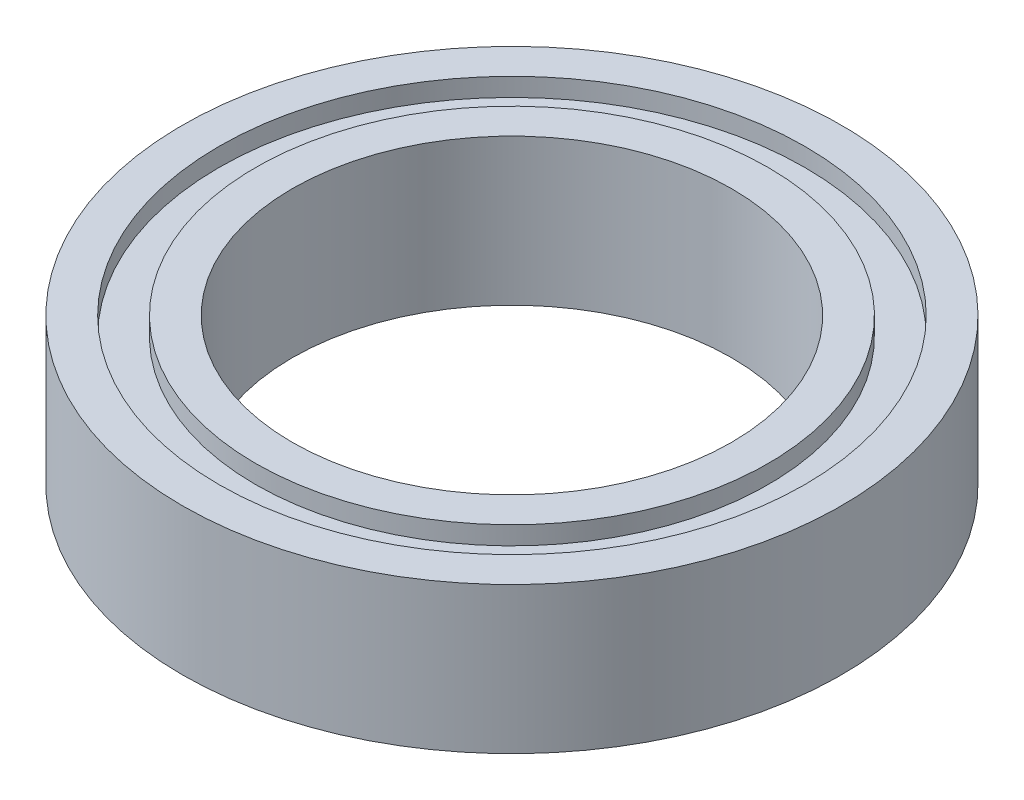
ISO-10303-21;
HEADER;
FILE_DESCRIPTION(('STEP AP214'),'2;1');
FILE_NAME('part.step','',(''),(''),'','','');
FILE_SCHEMA(('AUTOMOTIVE_DESIGN { 1 0 10303 214 1 1 1 1 }'));
ENDSEC;
DATA;
#1=APPLICATION_CONTEXT('core data for automotive mechanical design processes');
#2=APPLICATION_PROTOCOL_DEFINITION('international standard','automotive_design',2000,#1);
#3=PRODUCT_CONTEXT('',#1,'mechanical');
#4=PRODUCT('Part','Part','',(#3));
#5=PRODUCT_RELATED_PRODUCT_CATEGORY('part','',(#4));
#6=PRODUCT_DEFINITION_FORMATION('','',#4);
#7=PRODUCT_DEFINITION_CONTEXT('part definition',#1,'design');
#8=PRODUCT_DEFINITION('design','',#6,#7);
#9=PRODUCT_DEFINITION_SHAPE('','',#8);
#10=(LENGTH_UNIT() NAMED_UNIT(*) SI_UNIT(.MILLI.,.METRE.));
#11=(NAMED_UNIT(*) PLANE_ANGLE_UNIT() SI_UNIT($,.RADIAN.));
#12=(NAMED_UNIT(*) SI_UNIT($,.STERADIAN.) SOLID_ANGLE_UNIT());
#13=UNCERTAINTY_MEASURE_WITH_UNIT(LENGTH_MEASURE(1.E-05),#10,'distance_accuracy_value','');
#14=(GEOMETRIC_REPRESENTATION_CONTEXT(3) GLOBAL_UNCERTAINTY_ASSIGNED_CONTEXT((#13)) GLOBAL_UNIT_ASSIGNED_CONTEXT((#10,
#11,#12)) REPRESENTATION_CONTEXT('',''));
#15=CARTESIAN_POINT('',(0.,0.,0.));
#16=DIRECTION('',(0.,0.,1.));
#17=DIRECTION('',(1.,0.,0.));
#18=AXIS2_PLACEMENT_3D('',#15,#16,#17);
#19=CARTESIAN_POINT('',(0.,-2.,0.));
#20=DIRECTION('',(0.,1.,0.));
#21=DIRECTION('',(0.,0.,1.));
#22=AXIS2_PLACEMENT_3D('',#19,#20,#21);
#23=PLANE('',#22);
#24=CARTESIAN_POINT('',(0.,-2.,0.));
#25=DIRECTION('',(0.,1.,0.));
#26=DIRECTION('',(0.,0.,1.));
#27=AXIS2_PLACEMENT_3D('',#24,#25,#26);
#28=CIRCLE('',#27,6.);
#29=CARTESIAN_POINT('',(0.,-2.,6.));
#30=VERTEX_POINT('',#29);
#31=EDGE_CURVE('E58',#30,#30,#28,.T.);
#32=ORIENTED_EDGE('',*,*,#31,.T.);
#33=EDGE_LOOP('',(#32));
#34=FACE_BOUND('',#33,.T.);
#35=CARTESIAN_POINT('',(0.,-2.,0.));
#36=DIRECTION('',(0.,1.,0.));
#37=DIRECTION('',(0.,0.,1.));
#38=AXIS2_PLACEMENT_3D('',#35,#36,#37);
#39=CIRCLE('',#38,7.);
#40=CARTESIAN_POINT('',(0.,-2.,7.));
#41=VERTEX_POINT('',#40);
#42=EDGE_CURVE('E90',#41,#41,#39,.T.);
#43=ORIENTED_EDGE('',*,*,#42,.F.);
#44=EDGE_LOOP('',(#43));
#45=FACE_BOUND('',#44,.T.);
#46=ADVANCED_FACE('F43',(#34,#45),#23,.F.);
#47=CARTESIAN_POINT('',(0.,2.,0.));
#48=DIRECTION('',(0.,1.,0.));
#49=DIRECTION('',(0.,0.,1.));
#50=AXIS2_PLACEMENT_3D('',#47,#48,#49);
#51=PLANE('',#50);
#52=CARTESIAN_POINT('',(0.,2.,0.));
#53=DIRECTION('',(0.,1.,0.));
#54=DIRECTION('',(0.,0.,1.));
#55=AXIS2_PLACEMENT_3D('',#52,#53,#54);
#56=CIRCLE('',#55,6.);
#57=CARTESIAN_POINT('',(0.,2.,6.));
#58=VERTEX_POINT('',#57);
#59=EDGE_CURVE('E56',#58,#58,#56,.T.);
#60=ORIENTED_EDGE('',*,*,#59,.F.);
#61=EDGE_LOOP('',(#60));
#62=FACE_BOUND('',#61,.T.);
#63=CARTESIAN_POINT('',(0.,2.,0.));
#64=DIRECTION('',(0.,1.,0.));
#65=DIRECTION('',(0.,0.,1.));
#66=AXIS2_PLACEMENT_3D('',#63,#64,#65);
#67=CIRCLE('',#66,7.);
#68=CARTESIAN_POINT('',(0.,2.,7.));
#69=VERTEX_POINT('',#68);
#70=EDGE_CURVE('E74',#69,#69,#67,.T.);
#71=ORIENTED_EDGE('',*,*,#70,.T.);
#72=EDGE_LOOP('',(#71));
#73=FACE_BOUND('',#72,.T.);
#74=ADVANCED_FACE('F108',(#62,#73),#51,.T.);
#75=CARTESIAN_POINT('',(0.,2.,0.));
#76=DIRECTION('',(0.,1.,0.));
#77=DIRECTION('',(0.,0.,1.));
#78=AXIS2_PLACEMENT_3D('',#75,#76,#77);
#79=CIRCLE('',#78,8.);
#80=CARTESIAN_POINT('',(0.,2.,8.));
#81=VERTEX_POINT('',#80);
#82=EDGE_CURVE('E66',#81,#81,#79,.T.);
#83=ORIENTED_EDGE('',*,*,#82,.F.);
#84=EDGE_LOOP('',(#83));
#85=FACE_BOUND('',#84,.T.);
#86=CARTESIAN_POINT('',(0.,2.,0.));
#87=DIRECTION('',(0.,1.,0.));
#88=DIRECTION('',(0.,0.,1.));
#89=AXIS2_PLACEMENT_3D('',#86,#87,#88);
#90=CIRCLE('',#89,9.);
#91=CARTESIAN_POINT('',(0.,2.,9.));
#92=VERTEX_POINT('',#91);
#93=EDGE_CURVE('E10',#92,#92,#90,.T.);
#94=ORIENTED_EDGE('',*,*,#93,.T.);
#95=EDGE_LOOP('',(#94));
#96=FACE_BOUND('',#95,.T.);
#97=ADVANCED_FACE('F116',(#85,#96),#51,.T.);
#98=CARTESIAN_POINT('',(0.,-2.,0.));
#99=DIRECTION('',(0.,1.,0.));
#100=DIRECTION('',(0.,0.,1.));
#101=AXIS2_PLACEMENT_3D('',#98,#99,#100);
#102=CIRCLE('',#101,8.);
#103=CARTESIAN_POINT('',(0.,-2.,8.));
#104=VERTEX_POINT('',#103);
#105=EDGE_CURVE('E82',#104,#104,#102,.T.);
#106=ORIENTED_EDGE('',*,*,#105,.T.);
#107=EDGE_LOOP('',(#106));
#108=FACE_BOUND('',#107,.T.);
#109=CARTESIAN_POINT('',(0.,-2.,0.));
#110=DIRECTION('',(0.,1.,0.));
#111=DIRECTION('',(0.,0.,1.));
#112=AXIS2_PLACEMENT_3D('',#109,#110,#111);
#113=CIRCLE('',#112,9.);
#114=CARTESIAN_POINT('',(0.,-2.,9.));
#115=VERTEX_POINT('',#114);
#116=EDGE_CURVE('E47',#115,#115,#113,.T.);
#117=ORIENTED_EDGE('',*,*,#116,.F.);
#118=EDGE_LOOP('',(#117));
#119=FACE_BOUND('',#118,.T.);
#120=ADVANCED_FACE('F110',(#108,#119),#23,.F.);
#121=CARTESIAN_POINT('',(0.,2.,0.));
#122=DIRECTION('',(0.,-1.,0.));
#123=DIRECTION('',(0.,0.,-1.));
#124=AXIS2_PLACEMENT_3D('',#121,#122,#123);
#125=CYLINDRICAL_SURFACE('',#124,9.);
#126=ORIENTED_EDGE('',*,*,#93,.F.);
#127=EDGE_LOOP('',(#126));
#128=FACE_BOUND('',#127,.T.);
#129=ORIENTED_EDGE('',*,*,#116,.T.);
#130=EDGE_LOOP('',(#129));
#131=FACE_BOUND('',#130,.T.);
#132=ADVANCED_FACE('F45',(#128,#131),#125,.T.);
#133=CARTESIAN_POINT('',(0.,2.,0.));
#134=DIRECTION('',(0.,-1.,0.));
#135=DIRECTION('',(0.,0.,-1.));
#136=AXIS2_PLACEMENT_3D('',#133,#134,#135);
#137=CYLINDRICAL_SURFACE('',#136,6.);
#138=ORIENTED_EDGE('',*,*,#59,.T.);
#139=EDGE_LOOP('',(#138));
#140=FACE_BOUND('',#139,.T.);
#141=ORIENTED_EDGE('',*,*,#31,.F.);
#142=EDGE_LOOP('',(#141));
#143=FACE_BOUND('',#142,.T.);
#144=ADVANCED_FACE('F124',(#140,#143),#137,.F.);
#145=CARTESIAN_POINT('',(0.,1.5,0.));
#146=DIRECTION('',(0.,1.,0.));
#147=DIRECTION('',(0.,0.,1.));
#148=AXIS2_PLACEMENT_3D('',#145,#146,#147);
#149=CYLINDRICAL_SURFACE('',#148,8.);
#150=CARTESIAN_POINT('',(0.,1.5,0.));
#151=DIRECTION('',(0.,1.,0.));
#152=DIRECTION('',(0.,0.,1.));
#153=AXIS2_PLACEMENT_3D('',#150,#151,#152);
#154=CIRCLE('',#153,8.);
#155=CARTESIAN_POINT('',(0.,1.5,8.));
#156=VERTEX_POINT('',#155);
#157=EDGE_CURVE('E62',#156,#156,#154,.T.);
#158=ORIENTED_EDGE('',*,*,#157,.F.);
#159=EDGE_LOOP('',(#158));
#160=FACE_BOUND('',#159,.T.);
#161=ORIENTED_EDGE('',*,*,#82,.T.);
#162=EDGE_LOOP('',(#161));
#163=FACE_BOUND('',#162,.T.);
#164=ADVANCED_FACE('F147',(#160,#163),#149,.F.);
#165=CARTESIAN_POINT('',(0.,1.5,0.));
#166=DIRECTION('',(0.,1.,0.));
#167=DIRECTION('',(0.,0.,1.));
#168=AXIS2_PLACEMENT_3D('',#165,#166,#167);
#169=PLANE('',#168);
#170=CARTESIAN_POINT('',(0.,1.5,0.));
#171=DIRECTION('',(0.,1.,0.));
#172=DIRECTION('',(0.,0.,1.));
#173=AXIS2_PLACEMENT_3D('',#170,#171,#172);
#174=CIRCLE('',#173,7.);
#175=CARTESIAN_POINT('',(0.,1.5,7.));
#176=VERTEX_POINT('',#175);
#177=EDGE_CURVE('E70',#176,#176,#174,.T.);
#178=ORIENTED_EDGE('',*,*,#177,.F.);
#179=EDGE_LOOP('',(#178));
#180=FACE_BOUND('',#179,.T.);
#181=ORIENTED_EDGE('',*,*,#157,.T.);
#182=EDGE_LOOP('',(#181));
#183=FACE_BOUND('',#182,.T.);
#184=ADVANCED_FACE('F143',(#180,#183),#169,.T.);
#185=CARTESIAN_POINT('',(0.,1.5,0.));
#186=DIRECTION('',(0.,1.,0.));
#187=DIRECTION('',(0.,0.,1.));
#188=AXIS2_PLACEMENT_3D('',#185,#186,#187);
#189=CYLINDRICAL_SURFACE('',#188,7.);
#190=ORIENTED_EDGE('',*,*,#177,.T.);
#191=EDGE_LOOP('',(#190));
#192=FACE_BOUND('',#191,.T.);
#193=ORIENTED_EDGE('',*,*,#70,.F.);
#194=EDGE_LOOP('',(#193));
#195=FACE_BOUND('',#194,.T.);
#196=ADVANCED_FACE('F138',(#192,#195),#189,.T.);
#197=CARTESIAN_POINT('',(0.,-1.5,0.));
#198=DIRECTION('',(0.,-1.,0.));
#199=DIRECTION('',(0.,0.,1.));
#200=AXIS2_PLACEMENT_3D('',#197,#198,#199);
#201=PLANE('',#200);
#202=CARTESIAN_POINT('',(0.,-1.5,0.));
#203=DIRECTION('',(0.,1.,0.));
#204=DIRECTION('',(0.,0.,1.));
#205=AXIS2_PLACEMENT_3D('',#202,#203,#204);
#206=CIRCLE('',#205,8.);
#207=CARTESIAN_POINT('',(0.,-1.5,8.));
#208=VERTEX_POINT('',#207);
#209=EDGE_CURVE('E78',#208,#208,#206,.T.);
#210=ORIENTED_EDGE('',*,*,#209,.F.);
#211=EDGE_LOOP('',(#210));
#212=FACE_BOUND('',#211,.T.);
#213=CARTESIAN_POINT('',(0.,-1.5,0.));
#214=DIRECTION('',(0.,1.,0.));
#215=DIRECTION('',(0.,0.,1.));
#216=AXIS2_PLACEMENT_3D('',#213,#214,#215);
#217=CIRCLE('',#216,7.);
#218=CARTESIAN_POINT('',(0.,-1.5,7.));
#219=VERTEX_POINT('',#218);
#220=EDGE_CURVE('E86',#219,#219,#217,.T.);
#221=ORIENTED_EDGE('',*,*,#220,.T.);
#222=EDGE_LOOP('',(#221));
#223=FACE_BOUND('',#222,.T.);
#224=ADVANCED_FACE('F98',(#212,#223),#201,.T.);
#225=CARTESIAN_POINT('',(0.,-1.5,0.));
#226=DIRECTION('',(0.,-1.,0.));
#227=DIRECTION('',(0.,0.,-1.));
#228=AXIS2_PLACEMENT_3D('',#225,#226,#227);
#229=CYLINDRICAL_SURFACE('',#228,8.);
#230=ORIENTED_EDGE('',*,*,#209,.T.);
#231=EDGE_LOOP('',(#230));
#232=FACE_BOUND('',#231,.T.);
#233=ORIENTED_EDGE('',*,*,#105,.F.);
#234=EDGE_LOOP('',(#233));
#235=FACE_BOUND('',#234,.T.);
#236=ADVANCED_FACE('F103',(#232,#235),#229,.F.);
#237=CARTESIAN_POINT('',(0.,-1.5,0.));
#238=DIRECTION('',(0.,-1.,0.));
#239=DIRECTION('',(0.,0.,-1.));
#240=AXIS2_PLACEMENT_3D('',#237,#238,#239);
#241=CYLINDRICAL_SURFACE('',#240,7.);
#242=ORIENTED_EDGE('',*,*,#220,.F.);
#243=EDGE_LOOP('',(#242));
#244=FACE_BOUND('',#243,.T.);
#245=ORIENTED_EDGE('',*,*,#42,.T.);
#246=EDGE_LOOP('',(#245));
#247=FACE_BOUND('',#246,.T.);
#248=ADVANCED_FACE('F100',(#244,#247),#241,.T.);
#249=CLOSED_SHELL('',(#46,#74,#97,#120,#132,#144,#164,#184,#196,#224,#236,#248));
#250=MANIFOLD_SOLID_BREP('B2',#249);
#251=ADVANCED_BREP_SHAPE_REPRESENTATION('',(#18,#250),#14);
#252=SHAPE_DEFINITION_REPRESENTATION(#9,#251);
ENDSEC;
END-ISO-10303-21;
